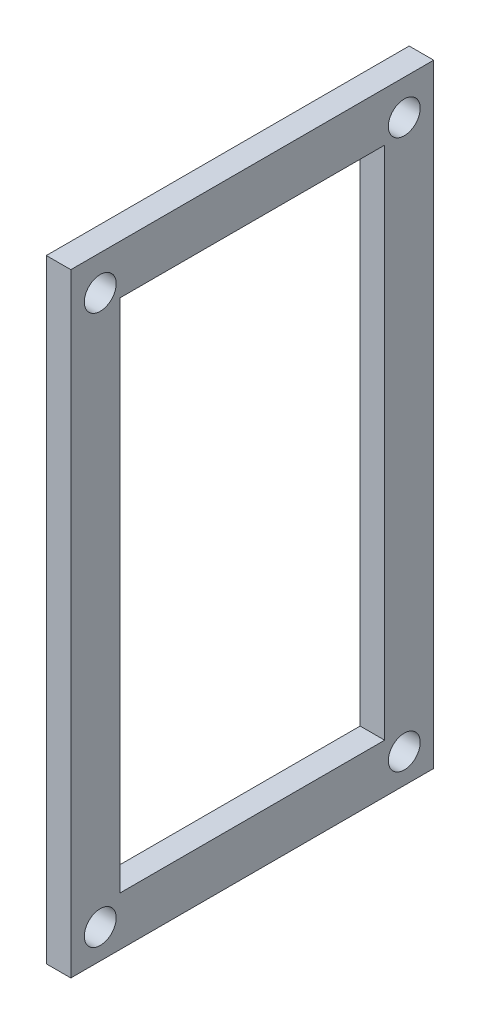
ISO-10303-21;
HEADER;
FILE_DESCRIPTION(('STEP AP214'),'2;1');
FILE_NAME('part.step','',(''),(''),'','','');
FILE_SCHEMA(('AUTOMOTIVE_DESIGN { 1 0 10303 214 1 1 1 1 }'));
ENDSEC;
DATA;
#1=APPLICATION_CONTEXT('core data for automotive mechanical design processes');
#2=APPLICATION_PROTOCOL_DEFINITION('international standard','automotive_design',2000,#1);
#3=PRODUCT_CONTEXT('',#1,'mechanical');
#4=PRODUCT('Part','Part','',(#3));
#5=PRODUCT_RELATED_PRODUCT_CATEGORY('part','',(#4));
#6=PRODUCT_DEFINITION_FORMATION('','',#4);
#7=PRODUCT_DEFINITION_CONTEXT('part definition',#1,'design');
#8=PRODUCT_DEFINITION('design','',#6,#7);
#9=PRODUCT_DEFINITION_SHAPE('','',#8);
#10=(LENGTH_UNIT() NAMED_UNIT(*) SI_UNIT(.MILLI.,.METRE.));
#11=(NAMED_UNIT(*) PLANE_ANGLE_UNIT() SI_UNIT($,.RADIAN.));
#12=(NAMED_UNIT(*) SI_UNIT($,.STERADIAN.) SOLID_ANGLE_UNIT());
#13=UNCERTAINTY_MEASURE_WITH_UNIT(LENGTH_MEASURE(1.E-05),#10,'distance_accuracy_value','');
#14=(GEOMETRIC_REPRESENTATION_CONTEXT(3) GLOBAL_UNCERTAINTY_ASSIGNED_CONTEXT((#13)) GLOBAL_UNIT_ASSIGNED_CONTEXT((#10,
#11,#12)) REPRESENTATION_CONTEXT('',''));
#15=CARTESIAN_POINT('',(0.,0.,0.));
#16=DIRECTION('',(0.,0.,1.));
#17=DIRECTION('',(1.,0.,0.));
#18=AXIS2_PLACEMENT_3D('',#15,#16,#17);
#19=CARTESIAN_POINT('',(5.,0.,0.));
#20=DIRECTION('',(1.,0.,0.));
#21=DIRECTION('',(0.,0.,-1.));
#22=AXIS2_PLACEMENT_3D('',#19,#20,#21);
#23=PLANE('',#22);
#24=CARTESIAN_POINT('',(5.,55.45,31.));
#25=DIRECTION('',(1.,0.,0.));
#26=DIRECTION('',(0.,0.,-1.));
#27=AXIS2_PLACEMENT_3D('',#24,#25,#26);
#28=CIRCLE('',#27,3.25000000000001);
#29=CARTESIAN_POINT('',(5.,55.45,27.75));
#30=VERTEX_POINT('',#29);
#31=EDGE_CURVE('E174',#30,#30,#28,.T.);
#32=ORIENTED_EDGE('',*,*,#31,.F.);
#33=EDGE_LOOP('',(#32));
#34=FACE_BOUND('',#33,.T.);
#35=CARTESIAN_POINT('',(5.,-56.55,31.));
#36=DIRECTION('',(1.,0.,0.));
#37=DIRECTION('',(0.,0.,-1.));
#38=AXIS2_PLACEMENT_3D('',#35,#36,#37);
#39=CIRCLE('',#38,3.25);
#40=CARTESIAN_POINT('',(5.,-56.55,27.75));
#41=VERTEX_POINT('',#40);
#42=EDGE_CURVE('E190',#41,#41,#39,.T.);
#43=ORIENTED_EDGE('',*,*,#42,.F.);
#44=EDGE_LOOP('',(#43));
#45=FACE_BOUND('',#44,.T.);
#46=DIRECTION('',(0.,1.,0.));
#47=VECTOR('',#46,1.);
#48=CARTESIAN_POINT('',(5.,-60.5500000000002,36.9999999999999));
#49=LINE('',#48,#47);
#50=CARTESIAN_POINT('',(5.,-62.5500000000002,36.9999999999999));
#51=VERTEX_POINT('',#50);
#52=CARTESIAN_POINT('',(5.,62.5499999999998,36.9999999999999));
#53=VERTEX_POINT('',#52);
#54=EDGE_CURVE('E122',#51,#53,#49,.T.);
#55=ORIENTED_EDGE('',*,*,#54,.F.);
#56=DIRECTION('',(0.,0.,1.));
#57=VECTOR('',#56,1.);
#58=CARTESIAN_POINT('',(5.,-62.5500000000002,-37.0000000000001));
#59=LINE('',#58,#57);
#60=CARTESIAN_POINT('',(5.,-62.5500000000002,-37.0000000000001));
#61=VERTEX_POINT('',#60);
#62=EDGE_CURVE('E139',#61,#51,#59,.T.);
#63=ORIENTED_EDGE('',*,*,#62,.F.);
#64=DIRECTION('',(0.,-1.,0.));
#65=VECTOR('',#64,1.);
#66=CARTESIAN_POINT('',(5.,62.5499999999998,-37.0000000000003));
#67=LINE('',#66,#65);
#68=CARTESIAN_POINT('',(5.,62.5499999999998,-37.0000000000003));
#69=VERTEX_POINT('',#68);
#70=EDGE_CURVE('E153',#69,#61,#67,.T.);
#71=ORIENTED_EDGE('',*,*,#70,.F.);
#72=DIRECTION('',(0.,0.,-1.));
#73=VECTOR('',#72,1.);
#74=CARTESIAN_POINT('',(5.,62.5499999999998,36.9999999999999));
#75=LINE('',#74,#73);
#76=EDGE_CURVE('E123',#53,#69,#75,.T.);
#77=ORIENTED_EDGE('',*,*,#76,.F.);
#78=EDGE_LOOP('',(#55,#63,#71,#77));
#79=FACE_BOUND('',#78,.T.);
#80=DIRECTION('',(0.,0.,1.));
#81=VECTOR('',#80,1.);
#82=CARTESIAN_POINT('',(5.,52.55,27.));
#83=LINE('',#82,#81);
#84=CARTESIAN_POINT('',(5.,52.55,-27.));
#85=VERTEX_POINT('',#84);
#86=CARTESIAN_POINT('',(5.,52.55,27.));
#87=VERTEX_POINT('',#86);
#88=EDGE_CURVE('E200',#85,#87,#83,.T.);
#89=ORIENTED_EDGE('',*,*,#88,.F.);
#90=DIRECTION('',(0.,1.,0.));
#91=VECTOR('',#90,1.);
#92=CARTESIAN_POINT('',(5.,52.55,-27.));
#93=LINE('',#92,#91);
#94=CARTESIAN_POINT('',(5.,-52.55,-27.));
#95=VERTEX_POINT('',#94);
#96=EDGE_CURVE('E197',#95,#85,#93,.T.);
#97=ORIENTED_EDGE('',*,*,#96,.F.);
#98=DIRECTION('',(0.,0.,-1.));
#99=VECTOR('',#98,1.);
#100=CARTESIAN_POINT('',(5.,-52.55,27.));
#101=LINE('',#100,#99);
#102=CARTESIAN_POINT('',(5.,-52.55,27.));
#103=VERTEX_POINT('',#102);
#104=EDGE_CURVE('E207',#103,#95,#101,.T.);
#105=ORIENTED_EDGE('',*,*,#104,.F.);
#106=DIRECTION('',(0.,-1.,0.));
#107=VECTOR('',#106,1.);
#108=CARTESIAN_POINT('',(5.,52.55,27.));
#109=LINE('',#108,#107);
#110=EDGE_CURVE('E204',#87,#103,#109,.T.);
#111=ORIENTED_EDGE('',*,*,#110,.F.);
#112=EDGE_LOOP('',(#89,#97,#105,#111));
#113=FACE_BOUND('',#112,.T.);
#114=CARTESIAN_POINT('',(5.,-56.5499999999994,-31.0000000000001));
#115=DIRECTION('',(1.,0.,0.));
#116=DIRECTION('',(0.,0.,1.));
#117=AXIS2_PLACEMENT_3D('',#114,#115,#116);
#118=CIRCLE('',#117,3.25);
#119=CARTESIAN_POINT('',(5.,-56.5499999999994,-27.7500000000001));
#120=VERTEX_POINT('',#119);
#121=EDGE_CURVE('E182',#120,#120,#118,.T.);
#122=ORIENTED_EDGE('',*,*,#121,.F.);
#123=EDGE_LOOP('',(#122));
#124=FACE_BOUND('',#123,.T.);
#125=CARTESIAN_POINT('',(5.,55.45,-31.));
#126=DIRECTION('',(1.,0.,0.));
#127=DIRECTION('',(0.,0.,1.));
#128=AXIS2_PLACEMENT_3D('',#125,#126,#127);
#129=CIRCLE('',#128,3.25000000000211);
#130=CARTESIAN_POINT('',(5.,55.45,-27.7499999999979));
#131=VERTEX_POINT('',#130);
#132=EDGE_CURVE('E166',#131,#131,#129,.T.);
#133=ORIENTED_EDGE('',*,*,#132,.F.);
#134=EDGE_LOOP('',(#133));
#135=FACE_BOUND('',#134,.T.);
#136=ADVANCED_FACE('F45',(#34,#45,#79,#113,#124,#135),#23,.T.);
#137=CARTESIAN_POINT('',(0.,0.,0.));
#138=DIRECTION('',(1.,0.,0.));
#139=DIRECTION('',(0.,0.,-1.));
#140=AXIS2_PLACEMENT_3D('',#137,#138,#139);
#141=PLANE('',#140);
#142=DIRECTION('',(0.,0.,1.));
#143=VECTOR('',#142,1.);
#144=CARTESIAN_POINT('',(0.,62.5499999999998,-35.0000000000003));
#145=LINE('',#144,#143);
#146=CARTESIAN_POINT('',(0.,62.5499999999998,-37.0000000000003));
#147=VERTEX_POINT('',#146);
#148=CARTESIAN_POINT('',(0.,62.5499999999998,36.9999999999999));
#149=VERTEX_POINT('',#148);
#150=EDGE_CURVE('E156',#147,#149,#145,.T.);
#151=ORIENTED_EDGE('',*,*,#150,.F.);
#152=DIRECTION('',(0.,1.,0.));
#153=VECTOR('',#152,1.);
#154=CARTESIAN_POINT('',(0.,-60.5500000000002,-37.0000000000001));
#155=LINE('',#154,#153);
#156=CARTESIAN_POINT('',(0.,-62.5500000000002,-37.0000000000001));
#157=VERTEX_POINT('',#156);
#158=EDGE_CURVE('E129',#157,#147,#155,.T.);
#159=ORIENTED_EDGE('',*,*,#158,.F.);
#160=DIRECTION('',(0.,0.,-1.));
#161=VECTOR('',#160,1.);
#162=CARTESIAN_POINT('',(0.,-62.5500000000002,36.9999999999999));
#163=LINE('',#162,#161);
#164=CARTESIAN_POINT('',(0.,-62.5500000000002,36.9999999999999));
#165=VERTEX_POINT('',#164);
#166=EDGE_CURVE('E126',#165,#157,#163,.T.);
#167=ORIENTED_EDGE('',*,*,#166,.F.);
#168=DIRECTION('',(0.,-1.,0.));
#169=VECTOR('',#168,1.);
#170=CARTESIAN_POINT('',(0.,60.5499999999998,36.9999999999999));
#171=LINE('',#170,#169);
#172=EDGE_CURVE('E112',#149,#165,#171,.T.);
#173=ORIENTED_EDGE('',*,*,#172,.F.);
#174=EDGE_LOOP('',(#151,#159,#167,#173));
#175=FACE_BOUND('',#174,.T.);
#176=DIRECTION('',(0.,1.,0.));
#177=VECTOR('',#176,1.);
#178=CARTESIAN_POINT('',(0.,52.55,-27.));
#179=LINE('',#178,#177);
#180=CARTESIAN_POINT('',(0.,-52.55,-27.));
#181=VERTEX_POINT('',#180);
#182=CARTESIAN_POINT('',(0.,52.55,-27.));
#183=VERTEX_POINT('',#182);
#184=EDGE_CURVE('E68',#181,#183,#179,.T.);
#185=ORIENTED_EDGE('',*,*,#184,.T.);
#186=DIRECTION('',(0.,0.,1.));
#187=VECTOR('',#186,1.);
#188=CARTESIAN_POINT('',(0.,52.55,27.));
#189=LINE('',#188,#187);
#190=CARTESIAN_POINT('',(0.,52.55,27.));
#191=VERTEX_POINT('',#190);
#192=EDGE_CURVE('E213',#183,#191,#189,.T.);
#193=ORIENTED_EDGE('',*,*,#192,.T.);
#194=DIRECTION('',(0.,-1.,0.));
#195=VECTOR('',#194,1.);
#196=CARTESIAN_POINT('',(0.,52.55,27.));
#197=LINE('',#196,#195);
#198=CARTESIAN_POINT('',(0.,-52.55,27.));
#199=VERTEX_POINT('',#198);
#200=EDGE_CURVE('E217',#191,#199,#197,.T.);
#201=ORIENTED_EDGE('',*,*,#200,.T.);
#202=DIRECTION('',(0.,0.,-1.));
#203=VECTOR('',#202,1.);
#204=CARTESIAN_POINT('',(0.,-52.55,27.));
#205=LINE('',#204,#203);
#206=EDGE_CURVE('E201',#199,#181,#205,.T.);
#207=ORIENTED_EDGE('',*,*,#206,.T.);
#208=EDGE_LOOP('',(#185,#193,#201,#207));
#209=FACE_BOUND('',#208,.T.);
#210=CARTESIAN_POINT('',(0.,-56.55,31.));
#211=DIRECTION('',(1.,0.,0.));
#212=DIRECTION('',(0.,0.,-1.));
#213=AXIS2_PLACEMENT_3D('',#210,#211,#212);
#214=CIRCLE('',#213,3.25);
#215=CARTESIAN_POINT('',(0.,-56.55,27.75));
#216=VERTEX_POINT('',#215);
#217=EDGE_CURVE('E186',#216,#216,#214,.T.);
#218=ORIENTED_EDGE('',*,*,#217,.T.);
#219=EDGE_LOOP('',(#218));
#220=FACE_BOUND('',#219,.T.);
#221=CARTESIAN_POINT('',(0.,-56.5499999999994,-31.0000000000001));
#222=DIRECTION('',(1.,0.,0.));
#223=DIRECTION('',(0.,0.,1.));
#224=AXIS2_PLACEMENT_3D('',#221,#222,#223);
#225=CIRCLE('',#224,3.25);
#226=CARTESIAN_POINT('',(0.,-56.5499999999994,-27.7500000000001));
#227=VERTEX_POINT('',#226);
#228=EDGE_CURVE('E178',#227,#227,#225,.T.);
#229=ORIENTED_EDGE('',*,*,#228,.T.);
#230=EDGE_LOOP('',(#229));
#231=FACE_BOUND('',#230,.T.);
#232=CARTESIAN_POINT('',(0.,55.45,31.));
#233=DIRECTION('',(1.,0.,0.));
#234=DIRECTION('',(0.,0.,-1.));
#235=AXIS2_PLACEMENT_3D('',#232,#233,#234);
#236=CIRCLE('',#235,3.25000000000001);
#237=CARTESIAN_POINT('',(0.,55.45,27.75));
#238=VERTEX_POINT('',#237);
#239=EDGE_CURVE('E170',#238,#238,#236,.T.);
#240=ORIENTED_EDGE('',*,*,#239,.T.);
#241=EDGE_LOOP('',(#240));
#242=FACE_BOUND('',#241,.T.);
#243=CARTESIAN_POINT('',(0.,55.45,-31.));
#244=DIRECTION('',(1.,0.,0.));
#245=DIRECTION('',(0.,0.,1.));
#246=AXIS2_PLACEMENT_3D('',#243,#244,#245);
#247=CIRCLE('',#246,3.25000000000211);
#248=CARTESIAN_POINT('',(0.,55.45,-27.7499999999979));
#249=VERTEX_POINT('',#248);
#250=EDGE_CURVE('E165',#249,#249,#247,.T.);
#251=ORIENTED_EDGE('',*,*,#250,.T.);
#252=EDGE_LOOP('',(#251));
#253=FACE_BOUND('',#252,.T.);
#254=ADVANCED_FACE('F47',(#175,#209,#220,#231,#242,#253),#141,.F.);
#255=CARTESIAN_POINT('',(5.,52.55,-27.));
#256=DIRECTION('',(0.,0.,1.));
#257=DIRECTION('',(0.,-1.,0.));
#258=AXIS2_PLACEMENT_3D('',#255,#256,#257);
#259=PLANE('',#258);
#260=ORIENTED_EDGE('',*,*,#184,.F.);
#261=DIRECTION('',(-1.,0.,0.));
#262=VECTOR('',#261,1.);
#263=CARTESIAN_POINT('',(5.,-52.55,-27.));
#264=LINE('',#263,#262);
#265=EDGE_CURVE('E210',#95,#181,#264,.T.);
#266=ORIENTED_EDGE('',*,*,#265,.F.);
#267=ORIENTED_EDGE('',*,*,#96,.T.);
#268=DIRECTION('',(-1.,0.,0.));
#269=VECTOR('',#268,1.);
#270=CARTESIAN_POINT('',(5.,52.55,-27.));
#271=LINE('',#270,#269);
#272=EDGE_CURVE('E11',#85,#183,#271,.T.);
#273=ORIENTED_EDGE('',*,*,#272,.T.);
#274=EDGE_LOOP('',(#260,#266,#267,#273));
#275=FACE_BOUND('',#274,.T.);
#276=ADVANCED_FACE('F241',(#275),#259,.T.);
#277=CARTESIAN_POINT('',(5.,52.55,27.));
#278=DIRECTION('',(0.,-1.,0.));
#279=DIRECTION('',(0.,0.,-1.));
#280=AXIS2_PLACEMENT_3D('',#277,#278,#279);
#281=PLANE('',#280);
#282=ORIENTED_EDGE('',*,*,#192,.F.);
#283=ORIENTED_EDGE('',*,*,#272,.F.);
#284=ORIENTED_EDGE('',*,*,#88,.T.);
#285=DIRECTION('',(-1.,0.,0.));
#286=VECTOR('',#285,1.);
#287=CARTESIAN_POINT('',(5.,52.55,27.));
#288=LINE('',#287,#286);
#289=EDGE_CURVE('E54',#87,#191,#288,.T.);
#290=ORIENTED_EDGE('',*,*,#289,.T.);
#291=EDGE_LOOP('',(#282,#283,#284,#290));
#292=FACE_BOUND('',#291,.T.);
#293=ADVANCED_FACE('F231',(#292),#281,.T.);
#294=CARTESIAN_POINT('',(5.,52.55,27.));
#295=DIRECTION('',(0.,0.,-1.));
#296=DIRECTION('',(0.,1.,0.));
#297=AXIS2_PLACEMENT_3D('',#294,#295,#296);
#298=PLANE('',#297);
#299=ORIENTED_EDGE('',*,*,#200,.F.);
#300=ORIENTED_EDGE('',*,*,#289,.F.);
#301=ORIENTED_EDGE('',*,*,#110,.T.);
#302=DIRECTION('',(-1.,0.,0.));
#303=VECTOR('',#302,1.);
#304=CARTESIAN_POINT('',(5.,-52.55,27.));
#305=LINE('',#304,#303);
#306=EDGE_CURVE('E61',#103,#199,#305,.T.);
#307=ORIENTED_EDGE('',*,*,#306,.T.);
#308=EDGE_LOOP('',(#299,#300,#301,#307));
#309=FACE_BOUND('',#308,.T.);
#310=ADVANCED_FACE('F236',(#309),#298,.T.);
#311=CARTESIAN_POINT('',(5.,-52.55,27.));
#312=DIRECTION('',(0.,1.,0.));
#313=DIRECTION('',(0.,0.,1.));
#314=AXIS2_PLACEMENT_3D('',#311,#312,#313);
#315=PLANE('',#314);
#316=ORIENTED_EDGE('',*,*,#206,.F.);
#317=ORIENTED_EDGE('',*,*,#306,.F.);
#318=ORIENTED_EDGE('',*,*,#104,.T.);
#319=ORIENTED_EDGE('',*,*,#265,.T.);
#320=EDGE_LOOP('',(#316,#317,#318,#319));
#321=FACE_BOUND('',#320,.T.);
#322=ADVANCED_FACE('F238',(#321),#315,.T.);
#323=CARTESIAN_POINT('',(5.,-56.55,31.));
#324=DIRECTION('',(-1.,0.,0.));
#325=DIRECTION('',(0.,0.,1.));
#326=AXIS2_PLACEMENT_3D('',#323,#324,#325);
#327=CYLINDRICAL_SURFACE('',#326,3.25);
#328=ORIENTED_EDGE('',*,*,#42,.T.);
#329=EDGE_LOOP('',(#328));
#330=FACE_BOUND('',#329,.T.);
#331=ORIENTED_EDGE('',*,*,#217,.F.);
#332=EDGE_LOOP('',(#331));
#333=FACE_BOUND('',#332,.T.);
#334=ADVANCED_FACE('F272',(#330,#333),#327,.F.);
#335=CARTESIAN_POINT('',(5.,-56.5499999999994,-31.0000000000001));
#336=DIRECTION('',(-1.,0.,0.));
#337=DIRECTION('',(0.,0.,1.));
#338=AXIS2_PLACEMENT_3D('',#335,#336,#337);
#339=CYLINDRICAL_SURFACE('',#338,3.25);
#340=ORIENTED_EDGE('',*,*,#121,.T.);
#341=EDGE_LOOP('',(#340));
#342=FACE_BOUND('',#341,.T.);
#343=ORIENTED_EDGE('',*,*,#228,.F.);
#344=EDGE_LOOP('',(#343));
#345=FACE_BOUND('',#344,.T.);
#346=ADVANCED_FACE('F275',(#342,#345),#339,.F.);
#347=CARTESIAN_POINT('',(5.,55.45,31.));
#348=DIRECTION('',(-1.,0.,0.));
#349=DIRECTION('',(0.,0.,1.));
#350=AXIS2_PLACEMENT_3D('',#347,#348,#349);
#351=CYLINDRICAL_SURFACE('',#350,3.25000000000001);
#352=ORIENTED_EDGE('',*,*,#31,.T.);
#353=EDGE_LOOP('',(#352));
#354=FACE_BOUND('',#353,.T.);
#355=ORIENTED_EDGE('',*,*,#239,.F.);
#356=EDGE_LOOP('',(#355));
#357=FACE_BOUND('',#356,.T.);
#358=ADVANCED_FACE('F253',(#354,#357),#351,.F.);
#359=CARTESIAN_POINT('',(5.,55.45,-31.));
#360=DIRECTION('',(-1.,0.,0.));
#361=DIRECTION('',(0.,0.,1.));
#362=AXIS2_PLACEMENT_3D('',#359,#360,#361);
#363=CYLINDRICAL_SURFACE('',#362,3.25000000000211);
#364=ORIENTED_EDGE('',*,*,#132,.T.);
#365=EDGE_LOOP('',(#364));
#366=FACE_BOUND('',#365,.T.);
#367=ORIENTED_EDGE('',*,*,#250,.F.);
#368=EDGE_LOOP('',(#367));
#369=FACE_BOUND('',#368,.T.);
#370=ADVANCED_FACE('F250',(#366,#369),#363,.F.);
#371=CARTESIAN_POINT('',(0.,0.,36.9999999999999));
#372=DIRECTION('',(0.,0.,1.));
#373=DIRECTION('',(1.,0.,0.));
#374=AXIS2_PLACEMENT_3D('',#371,#372,#373);
#375=PLANE('',#374);
#376=ORIENTED_EDGE('',*,*,#54,.T.);
#377=DIRECTION('',(1.,0.,0.));
#378=VECTOR('',#377,1.);
#379=CARTESIAN_POINT('',(0.,62.5499999999998,36.9999999999999));
#380=LINE('',#379,#378);
#381=EDGE_CURVE('E118',#149,#53,#380,.T.);
#382=ORIENTED_EDGE('',*,*,#381,.F.);
#383=ORIENTED_EDGE('',*,*,#172,.T.);
#384=DIRECTION('',(-1.,0.,0.));
#385=VECTOR('',#384,1.);
#386=CARTESIAN_POINT('',(5.,-62.5500000000002,36.9999999999999));
#387=LINE('',#386,#385);
#388=EDGE_CURVE('E116',#51,#165,#387,.T.);
#389=ORIENTED_EDGE('',*,*,#388,.F.);
#390=EDGE_LOOP('',(#376,#382,#383,#389));
#391=FACE_BOUND('',#390,.T.);
#392=ADVANCED_FACE('F114',(#391),#375,.T.);
#393=CARTESIAN_POINT('',(0.,62.5499999999998,0.));
#394=DIRECTION('',(0.,1.,0.));
#395=DIRECTION('',(0.,0.,1.));
#396=AXIS2_PLACEMENT_3D('',#393,#394,#395);
#397=PLANE('',#396);
#398=ORIENTED_EDGE('',*,*,#76,.T.);
#399=DIRECTION('',(1.,0.,0.));
#400=VECTOR('',#399,1.);
#401=CARTESIAN_POINT('',(0.,62.5499999999998,-37.0000000000003));
#402=LINE('',#401,#400);
#403=EDGE_CURVE('E149',#147,#69,#402,.T.);
#404=ORIENTED_EDGE('',*,*,#403,.F.);
#405=ORIENTED_EDGE('',*,*,#150,.T.);
#406=ORIENTED_EDGE('',*,*,#381,.T.);
#407=EDGE_LOOP('',(#398,#404,#405,#406));
#408=FACE_BOUND('',#407,.T.);
#409=ADVANCED_FACE('F284',(#408),#397,.T.);
#410=CARTESIAN_POINT('',(0.,0.,-37.0000000000002));
#411=DIRECTION('',(0.,0.,-1.));
#412=DIRECTION('',(0.,1.,0.));
#413=AXIS2_PLACEMENT_3D('',#410,#411,#412);
#414=PLANE('',#413);
#415=ORIENTED_EDGE('',*,*,#70,.T.);
#416=DIRECTION('',(1.,0.,0.));
#417=VECTOR('',#416,1.);
#418=CARTESIAN_POINT('',(0.,-62.5500000000002,-37.0000000000001));
#419=LINE('',#418,#417);
#420=EDGE_CURVE('E134',#157,#61,#419,.T.);
#421=ORIENTED_EDGE('',*,*,#420,.F.);
#422=ORIENTED_EDGE('',*,*,#158,.T.);
#423=ORIENTED_EDGE('',*,*,#403,.T.);
#424=EDGE_LOOP('',(#415,#421,#422,#423));
#425=FACE_BOUND('',#424,.T.);
#426=ADVANCED_FACE('F287',(#425),#414,.T.);
#427=CARTESIAN_POINT('',(0.,-62.5500000000002,0.));
#428=DIRECTION('',(0.,-1.,0.));
#429=DIRECTION('',(0.,0.,-1.));
#430=AXIS2_PLACEMENT_3D('',#427,#428,#429);
#431=PLANE('',#430);
#432=ORIENTED_EDGE('',*,*,#388,.T.);
#433=ORIENTED_EDGE('',*,*,#166,.T.);
#434=ORIENTED_EDGE('',*,*,#420,.T.);
#435=ORIENTED_EDGE('',*,*,#62,.T.);
#436=EDGE_LOOP('',(#432,#433,#434,#435));
#437=FACE_BOUND('',#436,.T.);
#438=ADVANCED_FACE('F137',(#437),#431,.T.);
#439=CLOSED_SHELL('',(#136,#254,#276,#293,#310,#322,#334,#346,#358,#370,#392,#409,#426,#438));
#440=MANIFOLD_SOLID_BREP('B2',#439);
#441=ADVANCED_BREP_SHAPE_REPRESENTATION('',(#18,#440),#14);
#442=SHAPE_DEFINITION_REPRESENTATION(#9,#441);
ENDSEC;
END-ISO-10303-21;
